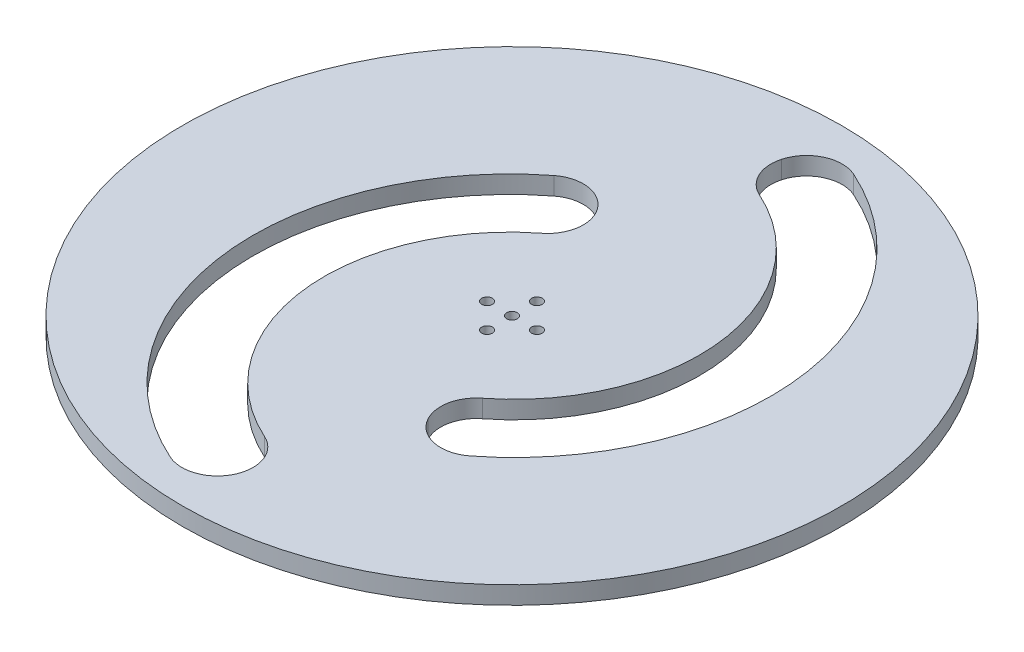
ISO-10303-21;
HEADER;
FILE_DESCRIPTION(('STEP AP214'),'2;1');
FILE_NAME('part.step','',(''),(''),'','','');
FILE_SCHEMA(('AUTOMOTIVE_DESIGN { 1 0 10303 214 1 1 1 1 }'));
ENDSEC;
DATA;
#1=APPLICATION_CONTEXT('core data for automotive mechanical design processes');
#2=APPLICATION_PROTOCOL_DEFINITION('international standard','automotive_design',2000,#1);
#3=PRODUCT_CONTEXT('',#1,'mechanical');
#4=PRODUCT('Part','Part','',(#3));
#5=PRODUCT_RELATED_PRODUCT_CATEGORY('part','',(#4));
#6=PRODUCT_DEFINITION_FORMATION('','',#4);
#7=PRODUCT_DEFINITION_CONTEXT('part definition',#1,'design');
#8=PRODUCT_DEFINITION('design','',#6,#7);
#9=PRODUCT_DEFINITION_SHAPE('','',#8);
#10=(LENGTH_UNIT() NAMED_UNIT(*) SI_UNIT(.MILLI.,.METRE.));
#11=(NAMED_UNIT(*) PLANE_ANGLE_UNIT() SI_UNIT($,.RADIAN.));
#12=(NAMED_UNIT(*) SI_UNIT($,.STERADIAN.) SOLID_ANGLE_UNIT());
#13=UNCERTAINTY_MEASURE_WITH_UNIT(LENGTH_MEASURE(1.E-05),#10,'distance_accuracy_value','');
#14=(GEOMETRIC_REPRESENTATION_CONTEXT(3) GLOBAL_UNCERTAINTY_ASSIGNED_CONTEXT((#13)) GLOBAL_UNIT_ASSIGNED_CONTEXT((#10,
#11,#12)) REPRESENTATION_CONTEXT('',''));
#15=CARTESIAN_POINT('',(0.,0.,0.));
#16=DIRECTION('',(0.,0.,1.));
#17=DIRECTION('',(1.,0.,0.));
#18=AXIS2_PLACEMENT_3D('',#15,#16,#17);
#19=CARTESIAN_POINT('',(0.,5.,0.));
#20=DIRECTION('',(0.,1.,0.));
#21=DIRECTION('',(0.,0.,1.));
#22=AXIS2_PLACEMENT_3D('',#19,#20,#21);
#23=PLANE('',#22);
#24=CARTESIAN_POINT('',(0.,5.,0.));
#25=DIRECTION('',(0.,1.,0.));
#26=DIRECTION('',(0.,0.,1.));
#27=AXIS2_PLACEMENT_3D('',#24,#25,#26);
#28=CIRCLE('',#27,1.5);
#29=CARTESIAN_POINT('',(0.,5.,1.5));
#30=VERTEX_POINT('',#29);
#31=EDGE_CURVE('E182',#30,#30,#28,.T.);
#32=ORIENTED_EDGE('',*,*,#31,.F.);
#33=EDGE_LOOP('',(#32));
#34=FACE_BOUND('',#33,.T.);
#35=CARTESIAN_POINT('',(16.0537430234526,5.,16.7632046132626));
#36=DIRECTION('',(0.,-1.,0.));
#37=DIRECTION('',(0.,0.,-1.));
#38=AXIS2_PLACEMENT_3D('',#35,#36,#37);
#39=CIRCLE('',#38,51.9529236373661);
#40=CARTESIAN_POINT('',(-5.3316199879469,5.,64.1105648706272));
#41=VERTEX_POINT('',#40);
#42=CARTESIAN_POINT('',(-15.9111647697599,5.,-24.1922705303786));
#43=VERTEX_POINT('',#42);
#44=EDGE_CURVE('E171',#41,#43,#39,.T.);
#45=ORIENTED_EDGE('',*,*,#44,.F.);
#46=CARTESIAN_POINT('',(-9.44791634128986,5.,73.2240770548213));
#47=DIRECTION('',(0.,1.,0.));
#48=DIRECTION('',(0.,0.,1.));
#49=AXIS2_PLACEMENT_3D('',#46,#47,#48);
#50=CIRCLE('',#49,10.);
#51=CARTESIAN_POINT('',(0.210513297476617,5.,75.8153579953983));
#52=VERTEX_POINT('',#51);
#53=EDGE_CURVE('E267',#41,#52,#50,.F.);
#54=ORIENTED_EDGE('',*,*,#53,.T.);
#55=CARTESIAN_POINT('',(-9.44791634128986,5.,73.2240770548213));
#56=DIRECTION('',(0.,1.,0.));
#57=DIRECTION('',(0.,0.,1.));
#58=AXIS2_PLACEMENT_3D('',#55,#56,#57);
#59=CIRCLE('',#58,10.);
#60=CARTESIAN_POINT('',(-13.5642126946328,5.,82.3375892390155));
#61=VERTEX_POINT('',#60);
#62=EDGE_CURVE('E169',#52,#61,#59,.F.);
#63=ORIENTED_EDGE('',*,*,#62,.T.);
#64=CARTESIAN_POINT('',(16.0537430234526,5.,16.7632046132626));
#65=DIRECTION('',(0.,1.,0.));
#66=DIRECTION('',(0.,0.,-1.));
#67=AXIS2_PLACEMENT_3D('',#64,#65,#66);
#68=CIRCLE('',#67,71.9529236373662);
#69=CARTESIAN_POINT('',(-28.2165002755456,5.,-39.95864988932));
#70=VERTEX_POINT('',#69);
#71=EDGE_CURVE('E160',#70,#61,#68,.T.);
#72=ORIENTED_EDGE('',*,*,#71,.F.);
#73=CARTESIAN_POINT('',(-22.0638325226528,5.,-32.0754602098493));
#74=DIRECTION('',(0.,1.,0.));
#75=DIRECTION('',(0.,0.,1.));
#76=AXIS2_PLACEMENT_3D('',#73,#74,#75);
#77=CIRCLE('',#76,10.);
#78=CARTESIAN_POINT('',(-13.2908955483083,5.,-36.8749994423361));
#79=VERTEX_POINT('',#78);
#80=EDGE_CURVE('E141',#70,#79,#77,.F.);
#81=ORIENTED_EDGE('',*,*,#80,.T.);
#82=CARTESIAN_POINT('',(-22.0638325226528,5.,-32.0754602098493));
#83=DIRECTION('',(0.,1.,0.));
#84=DIRECTION('',(0.,0.,1.));
#85=AXIS2_PLACEMENT_3D('',#82,#83,#84);
#86=CIRCLE('',#85,10.);
#87=EDGE_CURVE('E259',#79,#43,#86,.F.);
#88=ORIENTED_EDGE('',*,*,#87,.T.);
#89=EDGE_LOOP('',(#45,#54,#63,#72,#81,#88));
#90=FACE_BOUND('',#89,.T.);
#91=CARTESIAN_POINT('',(9.44791634129007,5.,-73.2240770548213));
#92=DIRECTION('',(0.,1.,0.));
#93=DIRECTION('',(0.,0.,1.));
#94=AXIS2_PLACEMENT_3D('',#91,#92,#93);
#95=CIRCLE('',#94,10.);
#96=CARTESIAN_POINT('',(5.33161998794708,5.,-64.1105648706271));
#97=VERTEX_POINT('',#96);
#98=CARTESIAN_POINT('',(-0.210513297476404,5.,-75.8153579953982));
#99=VERTEX_POINT('',#98);
#100=EDGE_CURVE('E74',#97,#99,#95,.F.);
#101=ORIENTED_EDGE('',*,*,#100,.T.);
#102=CARTESIAN_POINT('',(9.44791634129007,5.,-73.2240770548213));
#103=DIRECTION('',(0.,1.,0.));
#104=DIRECTION('',(0.,0.,1.));
#105=AXIS2_PLACEMENT_3D('',#102,#103,#104);
#106=CIRCLE('',#105,10.);
#107=CARTESIAN_POINT('',(13.5642126946331,5.,-82.3375892390154));
#108=VERTEX_POINT('',#107);
#109=EDGE_CURVE('E60',#99,#108,#106,.F.);
#110=ORIENTED_EDGE('',*,*,#109,.T.);
#111=CARTESIAN_POINT('',(-16.0537430234526,5.,-16.7632046132627));
#112=DIRECTION('',(0.,1.,0.));
#113=DIRECTION('',(0.,0.,-1.));
#114=AXIS2_PLACEMENT_3D('',#111,#112,#113);
#115=CIRCLE('',#114,71.9529236373662);
#116=CARTESIAN_POINT('',(28.2165002755454,5.,39.9586498893201));
#117=VERTEX_POINT('',#116);
#118=EDGE_CURVE('E194',#117,#108,#115,.T.);
#119=ORIENTED_EDGE('',*,*,#118,.F.);
#120=CARTESIAN_POINT('',(22.0638325226526,5.,32.0754602098494));
#121=DIRECTION('',(0.,1.,0.));
#122=DIRECTION('',(0.,0.,1.));
#123=AXIS2_PLACEMENT_3D('',#120,#121,#122);
#124=CIRCLE('',#123,10.);
#125=CARTESIAN_POINT('',(13.2908955483081,5.,36.8749994423361));
#126=VERTEX_POINT('',#125);
#127=EDGE_CURVE('E272',#117,#126,#124,.F.);
#128=ORIENTED_EDGE('',*,*,#127,.T.);
#129=CARTESIAN_POINT('',(22.0638325226526,5.,32.0754602098494));
#130=DIRECTION('',(0.,1.,0.));
#131=DIRECTION('',(0.,0.,1.));
#132=AXIS2_PLACEMENT_3D('',#129,#130,#131);
#133=CIRCLE('',#132,10.);
#134=CARTESIAN_POINT('',(15.9111647697598,5.,24.1922705303787));
#135=VERTEX_POINT('',#134);
#136=EDGE_CURVE('E277',#126,#135,#133,.F.);
#137=ORIENTED_EDGE('',*,*,#136,.T.);
#138=CARTESIAN_POINT('',(-16.0537430234526,5.,-16.7632046132627));
#139=DIRECTION('',(0.,-1.,0.));
#140=DIRECTION('',(0.,0.,-1.));
#141=AXIS2_PLACEMENT_3D('',#138,#139,#140);
#142=CIRCLE('',#141,51.9529236373661);
#143=EDGE_CURVE('E176',#97,#135,#142,.T.);
#144=ORIENTED_EDGE('',*,*,#143,.F.);
#145=EDGE_LOOP('',(#101,#110,#119,#128,#137,#144));
#146=FACE_BOUND('',#145,.T.);
#147=CARTESIAN_POINT('',(0.,5.,7.));
#148=DIRECTION('',(0.,1.,0.));
#149=DIRECTION('',(0.,0.,1.));
#150=AXIS2_PLACEMENT_3D('',#147,#148,#149);
#151=CIRCLE('',#150,1.5);
#152=CARTESIAN_POINT('',(0.,5.,8.5));
#153=VERTEX_POINT('',#152);
#154=EDGE_CURVE('E208',#153,#153,#151,.T.);
#155=ORIENTED_EDGE('',*,*,#154,.F.);
#156=EDGE_LOOP('',(#155));
#157=FACE_BOUND('',#156,.T.);
#158=CARTESIAN_POINT('',(0.,5.,-7.));
#159=DIRECTION('',(0.,1.,0.));
#160=DIRECTION('',(0.,0.,1.));
#161=AXIS2_PLACEMENT_3D('',#158,#159,#160);
#162=CIRCLE('',#161,1.5);
#163=CARTESIAN_POINT('',(0.,5.,-5.5));
#164=VERTEX_POINT('',#163);
#165=EDGE_CURVE('E219',#164,#164,#162,.T.);
#166=ORIENTED_EDGE('',*,*,#165,.F.);
#167=EDGE_LOOP('',(#166));
#168=FACE_BOUND('',#167,.T.);
#169=CARTESIAN_POINT('',(0.,5.,0.));
#170=DIRECTION('',(0.,1.,0.));
#171=DIRECTION('',(0.,0.,1.));
#172=AXIS2_PLACEMENT_3D('',#169,#170,#171);
#173=CIRCLE('',#172,92.5);
#174=CARTESIAN_POINT('',(0.,5.,92.5));
#175=VERTEX_POINT('',#174);
#176=EDGE_CURVE('E229',#175,#175,#173,.T.);
#177=ORIENTED_EDGE('',*,*,#176,.T.);
#178=EDGE_LOOP('',(#177));
#179=FACE_BOUND('',#178,.T.);
#180=CARTESIAN_POINT('',(7.,5.,0.));
#181=DIRECTION('',(0.,1.,0.));
#182=DIRECTION('',(0.,0.,1.));
#183=AXIS2_PLACEMENT_3D('',#180,#181,#182);
#184=CIRCLE('',#183,1.5);
#185=CARTESIAN_POINT('',(7.,5.,1.5));
#186=VERTEX_POINT('',#185);
#187=EDGE_CURVE('E228',#186,#186,#184,.T.);
#188=ORIENTED_EDGE('',*,*,#187,.F.);
#189=EDGE_LOOP('',(#188));
#190=FACE_BOUND('',#189,.T.);
#191=CARTESIAN_POINT('',(-7.,5.,0.));
#192=DIRECTION('',(0.,1.,0.));
#193=DIRECTION('',(0.,0.,1.));
#194=AXIS2_PLACEMENT_3D('',#191,#192,#193);
#195=CIRCLE('',#194,1.5);
#196=CARTESIAN_POINT('',(-7.,5.,1.5));
#197=VERTEX_POINT('',#196);
#198=EDGE_CURVE('E200',#197,#197,#195,.T.);
#199=ORIENTED_EDGE('',*,*,#198,.F.);
#200=EDGE_LOOP('',(#199));
#201=FACE_BOUND('',#200,.T.);
#202=ADVANCED_FACE('F51',(#34,#90,#146,#157,#168,#179,#190,#201),#23,.T.);
#203=CARTESIAN_POINT('',(0.,0.,0.));
#204=DIRECTION('',(0.,1.,0.));
#205=DIRECTION('',(0.,0.,1.));
#206=AXIS2_PLACEMENT_3D('',#203,#204,#205);
#207=PLANE('',#206);
#208=CARTESIAN_POINT('',(0.,0.,0.));
#209=DIRECTION('',(0.,1.,0.));
#210=DIRECTION('',(0.,0.,1.));
#211=AXIS2_PLACEMENT_3D('',#208,#209,#210);
#212=CIRCLE('',#211,1.5);
#213=CARTESIAN_POINT('',(0.,0.,1.5));
#214=VERTEX_POINT('',#213);
#215=EDGE_CURVE('E299',#214,#214,#212,.T.);
#216=ORIENTED_EDGE('',*,*,#215,.T.);
#217=EDGE_LOOP('',(#216));
#218=FACE_BOUND('',#217,.T.);
#219=CARTESIAN_POINT('',(-9.44791634128986,0.,73.2240770548213));
#220=DIRECTION('',(0.,1.,0.));
#221=DIRECTION('',(0.,0.,1.));
#222=AXIS2_PLACEMENT_3D('',#219,#220,#221);
#223=CIRCLE('',#222,10.);
#224=CARTESIAN_POINT('',(-13.5642126946328,0.,82.3375892390155));
#225=VERTEX_POINT('',#224);
#226=CARTESIAN_POINT('',(0.210513297476617,0.,75.8153579953983));
#227=VERTEX_POINT('',#226);
#228=EDGE_CURVE('E265',#225,#227,#223,.T.);
#229=ORIENTED_EDGE('',*,*,#228,.T.);
#230=CARTESIAN_POINT('',(-9.44791634128986,0.,73.2240770548213));
#231=DIRECTION('',(0.,1.,0.));
#232=DIRECTION('',(0.,0.,1.));
#233=AXIS2_PLACEMENT_3D('',#230,#231,#232);
#234=CIRCLE('',#233,10.);
#235=CARTESIAN_POINT('',(-5.3316199879469,0.,64.1105648706272));
#236=VERTEX_POINT('',#235);
#237=EDGE_CURVE('E270',#227,#236,#234,.T.);
#238=ORIENTED_EDGE('',*,*,#237,.T.);
#239=CARTESIAN_POINT('',(16.0537430234526,0.,16.7632046132626));
#240=DIRECTION('',(0.,1.,0.));
#241=DIRECTION('',(0.,0.,1.));
#242=AXIS2_PLACEMENT_3D('',#239,#240,#241);
#243=CIRCLE('',#242,51.9529236373661);
#244=CARTESIAN_POINT('',(-15.9111647697599,0.,-24.1922705303786));
#245=VERTEX_POINT('',#244);
#246=EDGE_CURVE('E242',#236,#245,#243,.F.);
#247=ORIENTED_EDGE('',*,*,#246,.T.);
#248=CARTESIAN_POINT('',(-22.0638325226528,0.,-32.0754602098493));
#249=DIRECTION('',(0.,1.,0.));
#250=DIRECTION('',(0.,0.,1.));
#251=AXIS2_PLACEMENT_3D('',#248,#249,#250);
#252=CIRCLE('',#251,10.);
#253=CARTESIAN_POINT('',(-13.2908955483083,0.,-36.8749994423361));
#254=VERTEX_POINT('',#253);
#255=EDGE_CURVE('E262',#245,#254,#252,.T.);
#256=ORIENTED_EDGE('',*,*,#255,.T.);
#257=CARTESIAN_POINT('',(-22.0638325226528,0.,-32.0754602098493));
#258=DIRECTION('',(0.,1.,0.));
#259=DIRECTION('',(0.,0.,1.));
#260=AXIS2_PLACEMENT_3D('',#257,#258,#259);
#261=CIRCLE('',#260,10.);
#262=CARTESIAN_POINT('',(-28.2165002755456,0.,-39.95864988932));
#263=VERTEX_POINT('',#262);
#264=EDGE_CURVE('E152',#254,#263,#261,.T.);
#265=ORIENTED_EDGE('',*,*,#264,.T.);
#266=CARTESIAN_POINT('',(16.0537430234526,0.,16.7632046132626));
#267=DIRECTION('',(0.,1.,0.));
#268=DIRECTION('',(0.,0.,1.));
#269=AXIS2_PLACEMENT_3D('',#266,#267,#268);
#270=CIRCLE('',#269,71.9529236373662);
#271=EDGE_CURVE('E163',#263,#225,#270,.T.);
#272=ORIENTED_EDGE('',*,*,#271,.T.);
#273=EDGE_LOOP('',(#229,#238,#247,#256,#265,#272));
#274=FACE_BOUND('',#273,.T.);
#275=CARTESIAN_POINT('',(-16.0537430234526,0.,-16.7632046132627));
#276=DIRECTION('',(0.,1.,0.));
#277=DIRECTION('',(0.,0.,1.));
#278=AXIS2_PLACEMENT_3D('',#275,#276,#277);
#279=CIRCLE('',#278,71.9529236373662);
#280=CARTESIAN_POINT('',(28.2165002755454,0.,39.9586498893201));
#281=VERTEX_POINT('',#280);
#282=CARTESIAN_POINT('',(13.5642126946331,0.,-82.3375892390154));
#283=VERTEX_POINT('',#282);
#284=EDGE_CURVE('E234',#281,#283,#279,.T.);
#285=ORIENTED_EDGE('',*,*,#284,.T.);
#286=CARTESIAN_POINT('',(9.44791634129007,0.,-73.2240770548213));
#287=DIRECTION('',(0.,1.,0.));
#288=DIRECTION('',(0.,0.,1.));
#289=AXIS2_PLACEMENT_3D('',#286,#287,#288);
#290=CIRCLE('',#289,10.);
#291=CARTESIAN_POINT('',(-0.210513297476404,0.,-75.8153579953982));
#292=VERTEX_POINT('',#291);
#293=EDGE_CURVE('E13',#283,#292,#290,.T.);
#294=ORIENTED_EDGE('',*,*,#293,.T.);
#295=CARTESIAN_POINT('',(9.44791634129007,0.,-73.2240770548213));
#296=DIRECTION('',(0.,1.,0.));
#297=DIRECTION('',(0.,0.,1.));
#298=AXIS2_PLACEMENT_3D('',#295,#296,#297);
#299=CIRCLE('',#298,10.);
#300=CARTESIAN_POINT('',(5.33161998794708,0.,-64.1105648706271));
#301=VERTEX_POINT('',#300);
#302=EDGE_CURVE('E284',#292,#301,#299,.T.);
#303=ORIENTED_EDGE('',*,*,#302,.T.);
#304=CARTESIAN_POINT('',(-16.0537430234526,0.,-16.7632046132627));
#305=DIRECTION('',(0.,1.,0.));
#306=DIRECTION('',(0.,0.,1.));
#307=AXIS2_PLACEMENT_3D('',#304,#305,#306);
#308=CIRCLE('',#307,51.9529236373661);
#309=CARTESIAN_POINT('',(15.9111647697598,0.,24.1922705303787));
#310=VERTEX_POINT('',#309);
#311=EDGE_CURVE('E238',#301,#310,#308,.F.);
#312=ORIENTED_EDGE('',*,*,#311,.T.);
#313=CARTESIAN_POINT('',(22.0638325226526,0.,32.0754602098494));
#314=DIRECTION('',(0.,1.,0.));
#315=DIRECTION('',(0.,0.,1.));
#316=AXIS2_PLACEMENT_3D('',#313,#314,#315);
#317=CIRCLE('',#316,10.);
#318=CARTESIAN_POINT('',(13.2908955483081,0.,36.8749994423361));
#319=VERTEX_POINT('',#318);
#320=EDGE_CURVE('E280',#310,#319,#317,.T.);
#321=ORIENTED_EDGE('',*,*,#320,.T.);
#322=CARTESIAN_POINT('',(22.0638325226526,0.,32.0754602098494));
#323=DIRECTION('',(0.,1.,0.));
#324=DIRECTION('',(0.,0.,1.));
#325=AXIS2_PLACEMENT_3D('',#322,#323,#324);
#326=CIRCLE('',#325,10.);
#327=EDGE_CURVE('E275',#319,#281,#326,.T.);
#328=ORIENTED_EDGE('',*,*,#327,.T.);
#329=EDGE_LOOP('',(#285,#294,#303,#312,#321,#328));
#330=FACE_BOUND('',#329,.T.);
#331=CARTESIAN_POINT('',(0.,0.,0.));
#332=DIRECTION('',(0.,1.,0.));
#333=DIRECTION('',(0.,0.,1.));
#334=AXIS2_PLACEMENT_3D('',#331,#332,#333);
#335=CIRCLE('',#334,92.5);
#336=CARTESIAN_POINT('',(0.,0.,92.5));
#337=VERTEX_POINT('',#336);
#338=EDGE_CURVE('E225',#337,#337,#335,.T.);
#339=ORIENTED_EDGE('',*,*,#338,.F.);
#340=EDGE_LOOP('',(#339));
#341=FACE_BOUND('',#340,.T.);
#342=CARTESIAN_POINT('',(0.,0.,-7.));
#343=DIRECTION('',(0.,1.,0.));
#344=DIRECTION('',(0.,0.,1.));
#345=AXIS2_PLACEMENT_3D('',#342,#343,#344);
#346=CIRCLE('',#345,1.5);
#347=CARTESIAN_POINT('',(0.,0.,-5.5));
#348=VERTEX_POINT('',#347);
#349=EDGE_CURVE('E226',#348,#348,#346,.T.);
#350=ORIENTED_EDGE('',*,*,#349,.T.);
#351=EDGE_LOOP('',(#350));
#352=FACE_BOUND('',#351,.T.);
#353=CARTESIAN_POINT('',(7.,0.,0.));
#354=DIRECTION('',(0.,1.,0.));
#355=DIRECTION('',(0.,0.,1.));
#356=AXIS2_PLACEMENT_3D('',#353,#354,#355);
#357=CIRCLE('',#356,1.5);
#358=CARTESIAN_POINT('',(7.,0.,1.5));
#359=VERTEX_POINT('',#358);
#360=EDGE_CURVE('E213',#359,#359,#357,.T.);
#361=ORIENTED_EDGE('',*,*,#360,.T.);
#362=EDGE_LOOP('',(#361));
#363=FACE_BOUND('',#362,.T.);
#364=CARTESIAN_POINT('',(0.,0.,7.));
#365=DIRECTION('',(0.,1.,0.));
#366=DIRECTION('',(0.,0.,1.));
#367=AXIS2_PLACEMENT_3D('',#364,#365,#366);
#368=CIRCLE('',#367,1.5);
#369=CARTESIAN_POINT('',(0.,0.,8.5));
#370=VERTEX_POINT('',#369);
#371=EDGE_CURVE('E205',#370,#370,#368,.T.);
#372=ORIENTED_EDGE('',*,*,#371,.T.);
#373=EDGE_LOOP('',(#372));
#374=FACE_BOUND('',#373,.T.);
#375=CARTESIAN_POINT('',(-7.,0.,0.));
#376=DIRECTION('',(0.,1.,0.));
#377=DIRECTION('',(0.,0.,1.));
#378=AXIS2_PLACEMENT_3D('',#375,#376,#377);
#379=CIRCLE('',#378,1.5);
#380=CARTESIAN_POINT('',(-7.,0.,1.5));
#381=VERTEX_POINT('',#380);
#382=EDGE_CURVE('E198',#381,#381,#379,.T.);
#383=ORIENTED_EDGE('',*,*,#382,.T.);
#384=EDGE_LOOP('',(#383));
#385=FACE_BOUND('',#384,.T.);
#386=ADVANCED_FACE('F305',(#218,#274,#330,#341,#352,#363,#374,#385),#207,.F.);
#387=CARTESIAN_POINT('',(0.,5.,0.));
#388=DIRECTION('',(0.,-1.,0.));
#389=DIRECTION('',(0.,0.,-1.));
#390=AXIS2_PLACEMENT_3D('',#387,#388,#389);
#391=CYLINDRICAL_SURFACE('',#390,92.5);
#392=ORIENTED_EDGE('',*,*,#176,.F.);
#393=EDGE_LOOP('',(#392));
#394=FACE_BOUND('',#393,.T.);
#395=ORIENTED_EDGE('',*,*,#338,.T.);
#396=EDGE_LOOP('',(#395));
#397=FACE_BOUND('',#396,.T.);
#398=ADVANCED_FACE('F322',(#394,#397),#391,.T.);
#399=CARTESIAN_POINT('',(0.,5.,-7.));
#400=DIRECTION('',(0.,-1.,0.));
#401=DIRECTION('',(0.,0.,-1.));
#402=AXIS2_PLACEMENT_3D('',#399,#400,#401);
#403=CYLINDRICAL_SURFACE('',#402,1.5);
#404=ORIENTED_EDGE('',*,*,#165,.T.);
#405=EDGE_LOOP('',(#404));
#406=FACE_BOUND('',#405,.T.);
#407=ORIENTED_EDGE('',*,*,#349,.F.);
#408=EDGE_LOOP('',(#407));
#409=FACE_BOUND('',#408,.T.);
#410=ADVANCED_FACE('F325',(#406,#409),#403,.F.);
#411=CARTESIAN_POINT('',(7.,5.,0.));
#412=DIRECTION('',(0.,-1.,0.));
#413=DIRECTION('',(0.,0.,-1.));
#414=AXIS2_PLACEMENT_3D('',#411,#412,#413);
#415=CYLINDRICAL_SURFACE('',#414,1.5);
#416=ORIENTED_EDGE('',*,*,#187,.T.);
#417=EDGE_LOOP('',(#416));
#418=FACE_BOUND('',#417,.T.);
#419=ORIENTED_EDGE('',*,*,#360,.F.);
#420=EDGE_LOOP('',(#419));
#421=FACE_BOUND('',#420,.T.);
#422=ADVANCED_FACE('F380',(#418,#421),#415,.F.);
#423=CARTESIAN_POINT('',(0.,5.,7.));
#424=DIRECTION('',(0.,-1.,0.));
#425=DIRECTION('',(0.,0.,-1.));
#426=AXIS2_PLACEMENT_3D('',#423,#424,#425);
#427=CYLINDRICAL_SURFACE('',#426,1.5);
#428=ORIENTED_EDGE('',*,*,#154,.T.);
#429=EDGE_LOOP('',(#428));
#430=FACE_BOUND('',#429,.T.);
#431=ORIENTED_EDGE('',*,*,#371,.F.);
#432=EDGE_LOOP('',(#431));
#433=FACE_BOUND('',#432,.T.);
#434=ADVANCED_FACE('F382',(#430,#433),#427,.F.);
#435=CARTESIAN_POINT('',(-7.,5.,0.));
#436=DIRECTION('',(0.,-1.,0.));
#437=DIRECTION('',(0.,0.,-1.));
#438=AXIS2_PLACEMENT_3D('',#435,#436,#437);
#439=CYLINDRICAL_SURFACE('',#438,1.5);
#440=ORIENTED_EDGE('',*,*,#198,.T.);
#441=EDGE_LOOP('',(#440));
#442=FACE_BOUND('',#441,.T.);
#443=ORIENTED_EDGE('',*,*,#382,.F.);
#444=EDGE_LOOP('',(#443));
#445=FACE_BOUND('',#444,.T.);
#446=ADVANCED_FACE('F387',(#442,#445),#439,.F.);
#447=CARTESIAN_POINT('',(-16.0537430234526,-25.,-16.7632046132627));
#448=DIRECTION('',(0.,1.,0.));
#449=DIRECTION('',(0.,0.,1.));
#450=AXIS2_PLACEMENT_3D('',#447,#448,#449);
#451=CYLINDRICAL_SURFACE('',#450,51.9529236373661);
#452=ORIENTED_EDGE('',*,*,#143,.T.);
#453=DIRECTION('',(0.,1.,0.));
#454=VECTOR('',#453,1.);
#455=CARTESIAN_POINT('',(15.9111647697598,-25.,24.1922705303787));
#456=LINE('',#455,#454);
#457=EDGE_CURVE('E153',#135,#310,#456,.F.);
#458=ORIENTED_EDGE('',*,*,#457,.T.);
#459=ORIENTED_EDGE('',*,*,#311,.F.);
#460=DIRECTION('',(0.,1.,0.));
#461=VECTOR('',#460,1.);
#462=CARTESIAN_POINT('',(5.33161998794709,-25.,-64.1105648706271));
#463=LINE('',#462,#461);
#464=EDGE_CURVE('E254',#301,#97,#463,.T.);
#465=ORIENTED_EDGE('',*,*,#464,.T.);
#466=EDGE_LOOP('',(#452,#458,#459,#465));
#467=FACE_BOUND('',#466,.T.);
#468=ADVANCED_FACE('F368',(#467),#451,.T.);
#469=CARTESIAN_POINT('',(-16.0537430234526,-25.,-16.7632046132627));
#470=DIRECTION('',(0.,1.,0.));
#471=DIRECTION('',(0.,0.,1.));
#472=AXIS2_PLACEMENT_3D('',#469,#470,#471);
#473=CYLINDRICAL_SURFACE('',#472,71.9529236373662);
#474=ORIENTED_EDGE('',*,*,#284,.F.);
#475=DIRECTION('',(0.,1.,0.));
#476=VECTOR('',#475,1.);
#477=CARTESIAN_POINT('',(28.2165002755454,-25.,39.9586498893201));
#478=LINE('',#477,#476);
#479=EDGE_CURVE('E251',#281,#117,#478,.T.);
#480=ORIENTED_EDGE('',*,*,#479,.T.);
#481=ORIENTED_EDGE('',*,*,#118,.T.);
#482=DIRECTION('',(0.,1.,0.));
#483=VECTOR('',#482,1.);
#484=CARTESIAN_POINT('',(13.5642126946331,-25.,-82.3375892390154));
#485=LINE('',#484,#483);
#486=EDGE_CURVE('E249',#108,#283,#485,.F.);
#487=ORIENTED_EDGE('',*,*,#486,.T.);
#488=EDGE_LOOP('',(#474,#480,#481,#487));
#489=FACE_BOUND('',#488,.T.);
#490=ADVANCED_FACE('F360',(#489),#473,.F.);
#491=CARTESIAN_POINT('',(16.0537430234526,-25.,16.7632046132626));
#492=DIRECTION('',(0.,1.,0.));
#493=DIRECTION('',(0.,0.,1.));
#494=AXIS2_PLACEMENT_3D('',#491,#492,#493);
#495=CYLINDRICAL_SURFACE('',#494,51.9529236373661);
#496=ORIENTED_EDGE('',*,*,#44,.T.);
#497=DIRECTION('',(0.,1.,0.));
#498=VECTOR('',#497,1.);
#499=CARTESIAN_POINT('',(-15.9111647697599,-25.,-24.1922705303786));
#500=LINE('',#499,#498);
#501=EDGE_CURVE('E247',#43,#245,#500,.F.);
#502=ORIENTED_EDGE('',*,*,#501,.T.);
#503=ORIENTED_EDGE('',*,*,#246,.F.);
#504=DIRECTION('',(0.,1.,0.));
#505=VECTOR('',#504,1.);
#506=CARTESIAN_POINT('',(-5.33161998794691,-25.,64.1105648706272));
#507=LINE('',#506,#505);
#508=EDGE_CURVE('E164',#236,#41,#507,.T.);
#509=ORIENTED_EDGE('',*,*,#508,.T.);
#510=EDGE_LOOP('',(#496,#502,#503,#509));
#511=FACE_BOUND('',#510,.T.);
#512=ADVANCED_FACE('F399',(#511),#495,.T.);
#513=CARTESIAN_POINT('',(16.0537430234526,-25.,16.7632046132626));
#514=DIRECTION('',(0.,1.,0.));
#515=DIRECTION('',(0.,0.,1.));
#516=AXIS2_PLACEMENT_3D('',#513,#514,#515);
#517=CYLINDRICAL_SURFACE('',#516,71.9529236373662);
#518=ORIENTED_EDGE('',*,*,#271,.F.);
#519=DIRECTION('',(0.,1.,0.));
#520=VECTOR('',#519,1.);
#521=CARTESIAN_POINT('',(-28.2165002755456,-25.,-39.95864988932));
#522=LINE('',#521,#520);
#523=EDGE_CURVE('E145',#263,#70,#522,.T.);
#524=ORIENTED_EDGE('',*,*,#523,.T.);
#525=ORIENTED_EDGE('',*,*,#71,.T.);
#526=DIRECTION('',(0.,1.,0.));
#527=VECTOR('',#526,1.);
#528=CARTESIAN_POINT('',(-13.5642126946328,-25.,82.3375892390155));
#529=LINE('',#528,#527);
#530=EDGE_CURVE('E165',#61,#225,#529,.F.);
#531=ORIENTED_EDGE('',*,*,#530,.T.);
#532=EDGE_LOOP('',(#518,#524,#525,#531));
#533=FACE_BOUND('',#532,.T.);
#534=ADVANCED_FACE('F158',(#533),#517,.F.);
#535=CARTESIAN_POINT('',(-22.0638325226528,-25.,-32.0754602098493));
#536=DIRECTION('',(0.,1.,0.));
#537=DIRECTION('',(0.,0.,1.));
#538=AXIS2_PLACEMENT_3D('',#535,#536,#537);
#539=CYLINDRICAL_SURFACE('',#538,10.);
#540=DIRECTION('',(0.,-1.,0.));
#541=VECTOR('',#540,1.);
#542=CARTESIAN_POINT('',(-13.2908955483083,5.,-36.8749994423361));
#543=LINE('',#542,#541);
#544=EDGE_CURVE('E147',#254,#79,#543,.F.);
#545=ORIENTED_EDGE('',*,*,#544,.F.);
#546=ORIENTED_EDGE('',*,*,#255,.F.);
#547=ORIENTED_EDGE('',*,*,#501,.F.);
#548=ORIENTED_EDGE('',*,*,#87,.F.);
#549=EDGE_LOOP('',(#545,#546,#547,#548));
#550=FACE_BOUND('',#549,.T.);
#551=ADVANCED_FACE('F334',(#550),#539,.F.);
#552=CARTESIAN_POINT('',(-22.0638325226528,-25.,-32.0754602098493));
#553=DIRECTION('',(0.,1.,0.));
#554=DIRECTION('',(0.,0.,1.));
#555=AXIS2_PLACEMENT_3D('',#552,#553,#554);
#556=CYLINDRICAL_SURFACE('',#555,10.);
#557=ORIENTED_EDGE('',*,*,#264,.F.);
#558=ORIENTED_EDGE('',*,*,#544,.T.);
#559=ORIENTED_EDGE('',*,*,#80,.F.);
#560=ORIENTED_EDGE('',*,*,#523,.F.);
#561=EDGE_LOOP('',(#557,#558,#559,#560));
#562=FACE_BOUND('',#561,.T.);
#563=ADVANCED_FACE('F144',(#562),#556,.F.);
#564=CARTESIAN_POINT('',(-9.44791634128986,-25.,73.2240770548213));
#565=DIRECTION('',(0.,1.,0.));
#566=DIRECTION('',(0.,0.,1.));
#567=AXIS2_PLACEMENT_3D('',#564,#565,#566);
#568=CYLINDRICAL_SURFACE('',#567,10.);
#569=ORIENTED_EDGE('',*,*,#508,.F.);
#570=ORIENTED_EDGE('',*,*,#237,.F.);
#571=DIRECTION('',(0.,-1.,0.));
#572=VECTOR('',#571,1.);
#573=CARTESIAN_POINT('',(0.210513297476621,0.,75.8153579953982));
#574=LINE('',#573,#572);
#575=EDGE_CURVE('E178',#52,#227,#574,.T.);
#576=ORIENTED_EDGE('',*,*,#575,.F.);
#577=ORIENTED_EDGE('',*,*,#53,.F.);
#578=EDGE_LOOP('',(#569,#570,#576,#577));
#579=FACE_BOUND('',#578,.T.);
#580=ADVANCED_FACE('F333',(#579),#568,.F.);
#581=CARTESIAN_POINT('',(-9.44791634128986,-25.,73.2240770548213));
#582=DIRECTION('',(0.,1.,0.));
#583=DIRECTION('',(0.,0.,1.));
#584=AXIS2_PLACEMENT_3D('',#581,#582,#583);
#585=CYLINDRICAL_SURFACE('',#584,10.);
#586=ORIENTED_EDGE('',*,*,#228,.F.);
#587=ORIENTED_EDGE('',*,*,#530,.F.);
#588=ORIENTED_EDGE('',*,*,#62,.F.);
#589=ORIENTED_EDGE('',*,*,#575,.T.);
#590=EDGE_LOOP('',(#586,#587,#588,#589));
#591=FACE_BOUND('',#590,.T.);
#592=ADVANCED_FACE('F338',(#591),#585,.F.);
#593=CARTESIAN_POINT('',(22.0638325226526,-25.,32.0754602098494));
#594=DIRECTION('',(0.,1.,0.));
#595=DIRECTION('',(0.,0.,1.));
#596=AXIS2_PLACEMENT_3D('',#593,#594,#595);
#597=CYLINDRICAL_SURFACE('',#596,10.);
#598=DIRECTION('',(0.,-1.,0.));
#599=VECTOR('',#598,1.);
#600=CARTESIAN_POINT('',(13.2908955483081,5.,36.8749994423361));
#601=LINE('',#600,#599);
#602=EDGE_CURVE('E289',#319,#126,#601,.F.);
#603=ORIENTED_EDGE('',*,*,#602,.F.);
#604=ORIENTED_EDGE('',*,*,#320,.F.);
#605=ORIENTED_EDGE('',*,*,#457,.F.);
#606=ORIENTED_EDGE('',*,*,#136,.F.);
#607=EDGE_LOOP('',(#603,#604,#605,#606));
#608=FACE_BOUND('',#607,.T.);
#609=ADVANCED_FACE('F341',(#608),#597,.F.);
#610=CARTESIAN_POINT('',(22.0638325226526,-25.,32.0754602098494));
#611=DIRECTION('',(0.,1.,0.));
#612=DIRECTION('',(0.,0.,1.));
#613=AXIS2_PLACEMENT_3D('',#610,#611,#612);
#614=CYLINDRICAL_SURFACE('',#613,10.);
#615=ORIENTED_EDGE('',*,*,#327,.F.);
#616=ORIENTED_EDGE('',*,*,#602,.T.);
#617=ORIENTED_EDGE('',*,*,#127,.F.);
#618=ORIENTED_EDGE('',*,*,#479,.F.);
#619=EDGE_LOOP('',(#615,#616,#617,#618));
#620=FACE_BOUND('',#619,.T.);
#621=ADVANCED_FACE('F346',(#620),#614,.F.);
#622=CARTESIAN_POINT('',(9.44791634129007,-25.,-73.2240770548213));
#623=DIRECTION('',(0.,1.,0.));
#624=DIRECTION('',(0.,0.,1.));
#625=AXIS2_PLACEMENT_3D('',#622,#623,#624);
#626=CYLINDRICAL_SURFACE('',#625,10.);
#627=DIRECTION('',(0.,-1.,0.));
#628=VECTOR('',#627,1.);
#629=CARTESIAN_POINT('',(-0.2105132974764,5.,-75.8153579953982));
#630=LINE('',#629,#628);
#631=EDGE_CURVE('E55',#292,#99,#630,.F.);
#632=ORIENTED_EDGE('',*,*,#631,.F.);
#633=ORIENTED_EDGE('',*,*,#293,.F.);
#634=ORIENTED_EDGE('',*,*,#486,.F.);
#635=ORIENTED_EDGE('',*,*,#109,.F.);
#636=EDGE_LOOP('',(#632,#633,#634,#635));
#637=FACE_BOUND('',#636,.T.);
#638=ADVANCED_FACE('F53',(#637),#626,.F.);
#639=CARTESIAN_POINT('',(9.44791634129007,-25.,-73.2240770548213));
#640=DIRECTION('',(0.,1.,0.));
#641=DIRECTION('',(0.,0.,1.));
#642=AXIS2_PLACEMENT_3D('',#639,#640,#641);
#643=CYLINDRICAL_SURFACE('',#642,10.);
#644=ORIENTED_EDGE('',*,*,#302,.F.);
#645=ORIENTED_EDGE('',*,*,#631,.T.);
#646=ORIENTED_EDGE('',*,*,#100,.F.);
#647=ORIENTED_EDGE('',*,*,#464,.F.);
#648=EDGE_LOOP('',(#644,#645,#646,#647));
#649=FACE_BOUND('',#648,.T.);
#650=ADVANCED_FACE('F310',(#649),#643,.F.);
#651=CARTESIAN_POINT('',(0.,269.245804129413,0.));
#652=DIRECTION('',(0.,-1.,0.));
#653=DIRECTION('',(0.,0.,-1.));
#654=AXIS2_PLACEMENT_3D('',#651,#652,#653);
#655=CYLINDRICAL_SURFACE('',#654,1.5);
#656=ORIENTED_EDGE('',*,*,#215,.F.);
#657=EDGE_LOOP('',(#656));
#658=FACE_BOUND('',#657,.T.);
#659=ORIENTED_EDGE('',*,*,#31,.T.);
#660=EDGE_LOOP('',(#659));
#661=FACE_BOUND('',#660,.T.);
#662=ADVANCED_FACE('F308',(#658,#661),#655,.F.);
#663=CLOSED_SHELL('',(#202,#386,#398,#410,#422,#434,#446,#468,#490,#512,#534,#551,#563,#580,
#592,#609,#621,#638,#650,#662));
#664=MANIFOLD_SOLID_BREP('B2',#663);
#665=ADVANCED_BREP_SHAPE_REPRESENTATION('',(#18,#664),#14);
#666=SHAPE_DEFINITION_REPRESENTATION(#9,#665);
ENDSEC;
END-ISO-10303-21;
